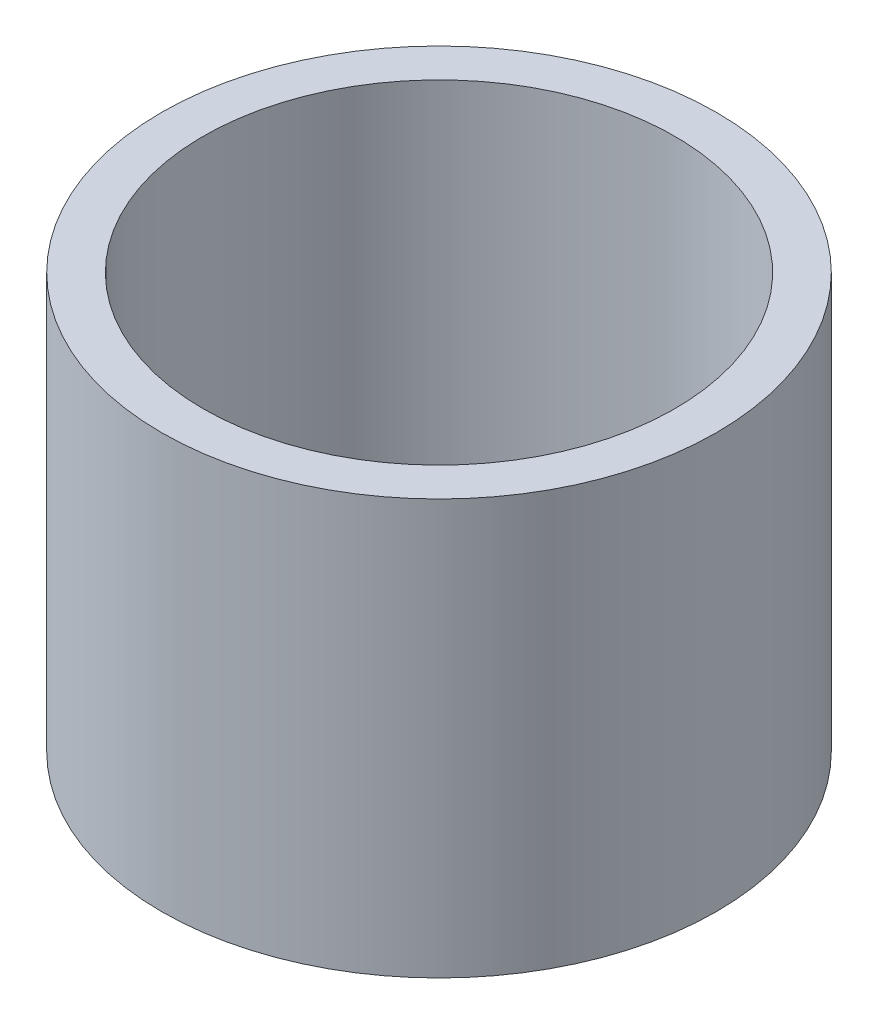
ISO-10303-21;
HEADER;
FILE_DESCRIPTION(('STEP AP214'),'2;1');
FILE_NAME('part.step','',(''),(''),'','','');
FILE_SCHEMA(('AUTOMOTIVE_DESIGN { 1 0 10303 214 1 1 1 1 }'));
ENDSEC;
DATA;
#1=APPLICATION_CONTEXT('core data for automotive mechanical design processes');
#2=APPLICATION_PROTOCOL_DEFINITION('international standard','automotive_design',2000,#1);
#3=PRODUCT_CONTEXT('',#1,'mechanical');
#4=PRODUCT('Part','Part','',(#3));
#5=PRODUCT_RELATED_PRODUCT_CATEGORY('part','',(#4));
#6=PRODUCT_DEFINITION_FORMATION('','',#4);
#7=PRODUCT_DEFINITION_CONTEXT('part definition',#1,'design');
#8=PRODUCT_DEFINITION('design','',#6,#7);
#9=PRODUCT_DEFINITION_SHAPE('','',#8);
#10=(LENGTH_UNIT() NAMED_UNIT(*) SI_UNIT(.MILLI.,.METRE.));
#11=(NAMED_UNIT(*) PLANE_ANGLE_UNIT() SI_UNIT($,.RADIAN.));
#12=(NAMED_UNIT(*) SI_UNIT($,.STERADIAN.) SOLID_ANGLE_UNIT());
#13=UNCERTAINTY_MEASURE_WITH_UNIT(LENGTH_MEASURE(1.E-05),#10,'distance_accuracy_value','');
#14=(GEOMETRIC_REPRESENTATION_CONTEXT(3) GLOBAL_UNCERTAINTY_ASSIGNED_CONTEXT((#13)) GLOBAL_UNIT_ASSIGNED_CONTEXT((#10,
#11,#12)) REPRESENTATION_CONTEXT('',''));
#15=CARTESIAN_POINT('',(0.,0.,0.));
#16=DIRECTION('',(0.,0.,1.));
#17=DIRECTION('',(1.,0.,0.));
#18=AXIS2_PLACEMENT_3D('',#15,#16,#17);
#19=CARTESIAN_POINT('',(0.,32.,0.));
#20=DIRECTION('',(0.,-1.,0.));
#21=DIRECTION('',(0.,0.,-1.));
#22=AXIS2_PLACEMENT_3D('',#19,#20,#21);
#23=CYLINDRICAL_SURFACE('',#22,21.4);
#24=CARTESIAN_POINT('',(0.,32.,0.));
#25=DIRECTION('',(0.,1.,0.));
#26=DIRECTION('',(0.,0.,1.));
#27=AXIS2_PLACEMENT_3D('',#24,#25,#26);
#28=CIRCLE('',#27,21.4);
#29=CARTESIAN_POINT('',(0.,32.,21.4));
#30=VERTEX_POINT('',#29);
#31=EDGE_CURVE('E10',#30,#30,#28,.T.);
#32=ORIENTED_EDGE('',*,*,#31,.F.);
#33=EDGE_LOOP('',(#32));
#34=FACE_BOUND('',#33,.T.);
#35=CARTESIAN_POINT('',(0.,0.,0.));
#36=DIRECTION('',(0.,1.,0.));
#37=DIRECTION('',(0.,0.,1.));
#38=AXIS2_PLACEMENT_3D('',#35,#36,#37);
#39=CIRCLE('',#38,21.4);
#40=CARTESIAN_POINT('',(0.,0.,21.4));
#41=VERTEX_POINT('',#40);
#42=EDGE_CURVE('E37',#41,#41,#39,.T.);
#43=ORIENTED_EDGE('',*,*,#42,.T.);
#44=EDGE_LOOP('',(#43));
#45=FACE_BOUND('',#44,.T.);
#46=ADVANCED_FACE('F34',(#34,#45),#23,.T.);
#47=CARTESIAN_POINT('',(0.,32.,0.));
#48=DIRECTION('',(0.,1.,0.));
#49=DIRECTION('',(0.,0.,1.));
#50=AXIS2_PLACEMENT_3D('',#47,#48,#49);
#51=PLANE('',#50);
#52=CARTESIAN_POINT('',(0.,32.,0.));
#53=DIRECTION('',(0.,1.,0.));
#54=DIRECTION('',(0.,0.,1.));
#55=AXIS2_PLACEMENT_3D('',#52,#53,#54);
#56=CIRCLE('',#55,18.2);
#57=CARTESIAN_POINT('',(0.,32.,18.2));
#58=VERTEX_POINT('',#57);
#59=EDGE_CURVE('E46',#58,#58,#56,.T.);
#60=ORIENTED_EDGE('',*,*,#59,.F.);
#61=EDGE_LOOP('',(#60));
#62=FACE_BOUND('',#61,.T.);
#63=ORIENTED_EDGE('',*,*,#31,.T.);
#64=EDGE_LOOP('',(#63));
#65=FACE_BOUND('',#64,.T.);
#66=ADVANCED_FACE('F61',(#62,#65),#51,.T.);
#67=CARTESIAN_POINT('',(0.,0.,0.));
#68=DIRECTION('',(0.,1.,0.));
#69=DIRECTION('',(0.,0.,1.));
#70=AXIS2_PLACEMENT_3D('',#67,#68,#69);
#71=PLANE('',#70);
#72=CARTESIAN_POINT('',(0.,0.,0.));
#73=DIRECTION('',(0.,1.,0.));
#74=DIRECTION('',(0.,0.,1.));
#75=AXIS2_PLACEMENT_3D('',#72,#73,#74);
#76=CIRCLE('',#75,18.2);
#77=CARTESIAN_POINT('',(0.,0.,18.2));
#78=VERTEX_POINT('',#77);
#79=EDGE_CURVE('E44',#78,#78,#76,.T.);
#80=ORIENTED_EDGE('',*,*,#79,.T.);
#81=EDGE_LOOP('',(#80));
#82=FACE_BOUND('',#81,.T.);
#83=ORIENTED_EDGE('',*,*,#42,.F.);
#84=EDGE_LOOP('',(#83));
#85=FACE_BOUND('',#84,.T.);
#86=ADVANCED_FACE('F52',(#82,#85),#71,.F.);
#87=CARTESIAN_POINT('',(0.,0.,0.));
#88=DIRECTION('',(0.,1.,0.));
#89=DIRECTION('',(0.,0.,1.));
#90=AXIS2_PLACEMENT_3D('',#87,#88,#89);
#91=CYLINDRICAL_SURFACE('',#90,18.2);
#92=ORIENTED_EDGE('',*,*,#79,.F.);
#93=EDGE_LOOP('',(#92));
#94=FACE_BOUND('',#93,.T.);
#95=ORIENTED_EDGE('',*,*,#59,.T.);
#96=EDGE_LOOP('',(#95));
#97=FACE_BOUND('',#96,.T.);
#98=ADVANCED_FACE('F55',(#94,#97),#91,.F.);
#99=CLOSED_SHELL('',(#46,#66,#86,#98));
#100=MANIFOLD_SOLID_BREP('B2',#99);
#101=ADVANCED_BREP_SHAPE_REPRESENTATION('',(#18,#100),#14);
#102=SHAPE_DEFINITION_REPRESENTATION(#9,#101);
ENDSEC;
END-ISO-10303-21;
